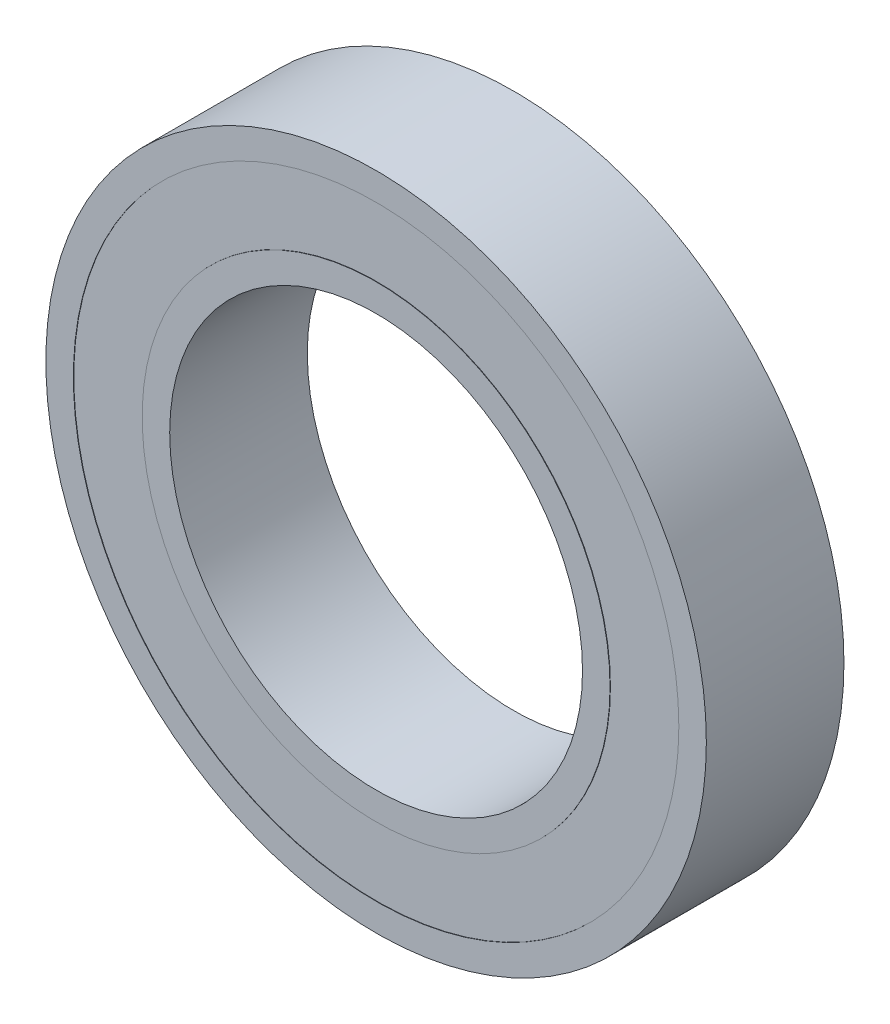
ISO-10303-21;
HEADER;
FILE_DESCRIPTION(('STEP AP214'),'2;1');
FILE_NAME('part.step','',(''),(''),'','','');
FILE_SCHEMA(('AUTOMOTIVE_DESIGN { 1 0 10303 214 1 1 1 1 }'));
ENDSEC;
DATA;
#1=APPLICATION_CONTEXT('core data for automotive mechanical design processes');
#2=APPLICATION_PROTOCOL_DEFINITION('international standard','automotive_design',2000,#1);
#3=PRODUCT_CONTEXT('',#1,'mechanical');
#4=PRODUCT('Part','Part','',(#3));
#5=PRODUCT_RELATED_PRODUCT_CATEGORY('part','',(#4));
#6=PRODUCT_DEFINITION_FORMATION('','',#4);
#7=PRODUCT_DEFINITION_CONTEXT('part definition',#1,'design');
#8=PRODUCT_DEFINITION('design','',#6,#7);
#9=PRODUCT_DEFINITION_SHAPE('','',#8);
#10=(LENGTH_UNIT() NAMED_UNIT(*) SI_UNIT(.MILLI.,.METRE.));
#11=(NAMED_UNIT(*) PLANE_ANGLE_UNIT() SI_UNIT($,.RADIAN.));
#12=(NAMED_UNIT(*) SI_UNIT($,.STERADIAN.) SOLID_ANGLE_UNIT());
#13=UNCERTAINTY_MEASURE_WITH_UNIT(LENGTH_MEASURE(1.E-05),#10,'distance_accuracy_value','');
#14=(GEOMETRIC_REPRESENTATION_CONTEXT(3) GLOBAL_UNCERTAINTY_ASSIGNED_CONTEXT((#13)) GLOBAL_UNIT_ASSIGNED_CONTEXT((#10,
#11,#12)) REPRESENTATION_CONTEXT('',''));
#15=CARTESIAN_POINT('',(0.,0.,0.));
#16=DIRECTION('',(0.,0.,1.));
#17=DIRECTION('',(1.,0.,0.));
#18=AXIS2_PLACEMENT_3D('',#15,#16,#17);
#19=CARTESIAN_POINT('',(0.,0.,-2.5));
#20=DIRECTION('',(0.,0.,1.));
#21=DIRECTION('',(1.,0.,0.));
#22=AXIS2_PLACEMENT_3D('',#19,#20,#21);
#23=CYLINDRICAL_SURFACE('',#22,11.);
#24=CARTESIAN_POINT('',(0.,0.,-2.5));
#25=DIRECTION('',(0.,0.,1.));
#26=DIRECTION('',(1.,0.,0.));
#27=AXIS2_PLACEMENT_3D('',#24,#25,#26);
#28=CIRCLE('',#27,11.);
#29=CARTESIAN_POINT('',(11.,0.,-2.5));
#30=VERTEX_POINT('',#29);
#31=EDGE_CURVE('E60',#30,#30,#28,.T.);
#32=ORIENTED_EDGE('',*,*,#31,.F.);
#33=EDGE_LOOP('',(#32));
#34=FACE_BOUND('',#33,.T.);
#35=CARTESIAN_POINT('',(0.,0.,-2.484375));
#36=DIRECTION('',(0.,0.,1.));
#37=DIRECTION('',(1.,0.,0.));
#38=AXIS2_PLACEMENT_3D('',#35,#36,#37);
#39=CIRCLE('',#38,11.);
#40=CARTESIAN_POINT('',(11.,0.,-2.484375));
#41=VERTEX_POINT('',#40);
#42=EDGE_CURVE('E11',#41,#41,#39,.F.);
#43=ORIENTED_EDGE('',*,*,#42,.F.);
#44=EDGE_LOOP('',(#43));
#45=FACE_BOUND('',#44,.T.);
#46=ADVANCED_FACE('F49',(#34,#45),#23,.F.);
#47=CARTESIAN_POINT('',(0.,0.,2.484375));
#48=DIRECTION('',(0.,0.,1.));
#49=DIRECTION('',(1.,0.,0.));
#50=AXIS2_PLACEMENT_3D('',#47,#48,#49);
#51=CIRCLE('',#50,11.);
#52=CARTESIAN_POINT('',(11.,0.,2.484375));
#53=VERTEX_POINT('',#52);
#54=EDGE_CURVE('E72',#53,#53,#51,.T.);
#55=ORIENTED_EDGE('',*,*,#54,.F.);
#56=EDGE_LOOP('',(#55));
#57=FACE_BOUND('',#56,.T.);
#58=CARTESIAN_POINT('',(0.,0.,2.5));
#59=DIRECTION('',(0.,0.,1.));
#60=DIRECTION('',(1.,0.,0.));
#61=AXIS2_PLACEMENT_3D('',#58,#59,#60);
#62=CIRCLE('',#61,11.);
#63=CARTESIAN_POINT('',(11.,0.,2.5));
#64=VERTEX_POINT('',#63);
#65=EDGE_CURVE('E69',#64,#64,#62,.T.);
#66=ORIENTED_EDGE('',*,*,#65,.T.);
#67=EDGE_LOOP('',(#66));
#68=FACE_BOUND('',#67,.T.);
#69=ADVANCED_FACE('F51',(#57,#68),#23,.F.);
#70=CARTESIAN_POINT('',(0.,0.,-2.5));
#71=DIRECTION('',(0.,0.,1.));
#72=DIRECTION('',(1.,0.,0.));
#73=AXIS2_PLACEMENT_3D('',#70,#71,#72);
#74=CYLINDRICAL_SURFACE('',#73,12.);
#75=CARTESIAN_POINT('',(0.,0.,-2.5));
#76=DIRECTION('',(0.,0.,1.));
#77=DIRECTION('',(1.,0.,0.));
#78=AXIS2_PLACEMENT_3D('',#75,#76,#77);
#79=CIRCLE('',#78,12.);
#80=CARTESIAN_POINT('',(12.,0.,-2.5));
#81=VERTEX_POINT('',#80);
#82=EDGE_CURVE('E56',#81,#81,#79,.T.);
#83=ORIENTED_EDGE('',*,*,#82,.T.);
#84=EDGE_LOOP('',(#83));
#85=FACE_BOUND('',#84,.T.);
#86=CARTESIAN_POINT('',(0.,0.,2.5));
#87=DIRECTION('',(0.,0.,1.));
#88=DIRECTION('',(1.,0.,0.));
#89=AXIS2_PLACEMENT_3D('',#86,#87,#88);
#90=CIRCLE('',#89,12.);
#91=CARTESIAN_POINT('',(12.,0.,2.5));
#92=VERTEX_POINT('',#91);
#93=EDGE_CURVE('E64',#92,#92,#90,.T.);
#94=ORIENTED_EDGE('',*,*,#93,.F.);
#95=EDGE_LOOP('',(#94));
#96=FACE_BOUND('',#95,.T.);
#97=ADVANCED_FACE('F124',(#85,#96),#74,.T.);
#98=CARTESIAN_POINT('',(0.,0.,-2.5));
#99=DIRECTION('',(0.,0.,1.));
#100=DIRECTION('',(1.,0.,0.));
#101=AXIS2_PLACEMENT_3D('',#98,#99,#100);
#102=PLANE('',#101);
#103=ORIENTED_EDGE('',*,*,#31,.T.);
#104=EDGE_LOOP('',(#103));
#105=FACE_BOUND('',#104,.T.);
#106=ORIENTED_EDGE('',*,*,#82,.F.);
#107=EDGE_LOOP('',(#106));
#108=FACE_BOUND('',#107,.T.);
#109=ADVANCED_FACE('F129',(#105,#108),#102,.F.);
#110=CARTESIAN_POINT('',(0.,0.,2.5));
#111=DIRECTION('',(0.,0.,1.));
#112=DIRECTION('',(1.,0.,0.));
#113=AXIS2_PLACEMENT_3D('',#110,#111,#112);
#114=PLANE('',#113);
#115=ORIENTED_EDGE('',*,*,#65,.F.);
#116=EDGE_LOOP('',(#115));
#117=FACE_BOUND('',#116,.T.);
#118=ORIENTED_EDGE('',*,*,#93,.T.);
#119=EDGE_LOOP('',(#118));
#120=FACE_BOUND('',#119,.T.);
#121=ADVANCED_FACE('F132',(#117,#120),#114,.T.);
#122=CARTESIAN_POINT('',(0.,0.,-2.484375));
#123=DIRECTION('',(0.,0.,1.));
#124=DIRECTION('',(1.,0.,0.));
#125=AXIS2_PLACEMENT_3D('',#122,#123,#124);
#126=PLANE('',#125);
#127=CARTESIAN_POINT('',(0.,0.,-2.484375));
#128=DIRECTION('',(0.,0.,1.));
#129=DIRECTION('',(1.,0.,0.));
#130=AXIS2_PLACEMENT_3D('',#127,#128,#129);
#131=CIRCLE('',#130,8.5);
#132=CARTESIAN_POINT('',(8.5,0.,-2.484375));
#133=VERTEX_POINT('',#132);
#134=EDGE_CURVE('E78',#133,#133,#131,.T.);
#135=ORIENTED_EDGE('',*,*,#134,.T.);
#136=EDGE_LOOP('',(#135));
#137=FACE_BOUND('',#136,.T.);
#138=ORIENTED_EDGE('',*,*,#42,.T.);
#139=EDGE_LOOP('',(#138));
#140=FACE_BOUND('',#139,.T.);
#141=ADVANCED_FACE('F138',(#137,#140),#126,.F.);
#142=CARTESIAN_POINT('',(0.,0.,2.484375));
#143=DIRECTION('',(0.,0.,1.));
#144=DIRECTION('',(1.,0.,0.));
#145=AXIS2_PLACEMENT_3D('',#142,#143,#144);
#146=PLANE('',#145);
#147=CARTESIAN_POINT('',(0.,0.,2.484375));
#148=DIRECTION('',(0.,0.,1.));
#149=DIRECTION('',(1.,0.,0.));
#150=AXIS2_PLACEMENT_3D('',#147,#148,#149);
#151=CIRCLE('',#150,8.5);
#152=CARTESIAN_POINT('',(8.5,0.,2.484375));
#153=VERTEX_POINT('',#152);
#154=EDGE_CURVE('E75',#153,#153,#151,.T.);
#155=ORIENTED_EDGE('',*,*,#154,.F.);
#156=EDGE_LOOP('',(#155));
#157=FACE_BOUND('',#156,.T.);
#158=ORIENTED_EDGE('',*,*,#54,.T.);
#159=EDGE_LOOP('',(#158));
#160=FACE_BOUND('',#159,.T.);
#161=ADVANCED_FACE('F117',(#157,#160),#146,.T.);
#162=CARTESIAN_POINT('',(0.,0.,-2.5));
#163=DIRECTION('',(0.,0.,1.));
#164=DIRECTION('',(1.,0.,0.));
#165=AXIS2_PLACEMENT_3D('',#162,#163,#164);
#166=CYLINDRICAL_SURFACE('',#165,8.5);
#167=CARTESIAN_POINT('',(0.,0.,-2.5));
#168=DIRECTION('',(0.,0.,1.));
#169=DIRECTION('',(1.,0.,0.));
#170=AXIS2_PLACEMENT_3D('',#167,#168,#169);
#171=CIRCLE('',#170,8.5);
#172=CARTESIAN_POINT('',(8.5,0.,-2.5));
#173=VERTEX_POINT('',#172);
#174=EDGE_CURVE('E81',#173,#173,#171,.T.);
#175=ORIENTED_EDGE('',*,*,#174,.T.);
#176=EDGE_LOOP('',(#175));
#177=FACE_BOUND('',#176,.T.);
#178=ORIENTED_EDGE('',*,*,#134,.F.);
#179=EDGE_LOOP('',(#178));
#180=FACE_BOUND('',#179,.T.);
#181=ADVANCED_FACE('F107',(#177,#180),#166,.T.);
#182=CARTESIAN_POINT('',(0.,0.,-2.5));
#183=DIRECTION('',(0.,0.,1.));
#184=DIRECTION('',(1.,0.,0.));
#185=AXIS2_PLACEMENT_3D('',#182,#183,#184);
#186=CYLINDRICAL_SURFACE('',#185,7.5);
#187=CARTESIAN_POINT('',(0.,0.,-2.5));
#188=DIRECTION('',(0.,0.,1.));
#189=DIRECTION('',(1.,0.,0.));
#190=AXIS2_PLACEMENT_3D('',#187,#188,#189);
#191=CIRCLE('',#190,7.5);
#192=CARTESIAN_POINT('',(7.5,0.,-2.5));
#193=VERTEX_POINT('',#192);
#194=EDGE_CURVE('E84',#193,#193,#191,.T.);
#195=ORIENTED_EDGE('',*,*,#194,.F.);
#196=EDGE_LOOP('',(#195));
#197=FACE_BOUND('',#196,.T.);
#198=CARTESIAN_POINT('',(0.,0.,2.5));
#199=DIRECTION('',(0.,0.,1.));
#200=DIRECTION('',(1.,0.,0.));
#201=AXIS2_PLACEMENT_3D('',#198,#199,#200);
#202=CIRCLE('',#201,7.5);
#203=CARTESIAN_POINT('',(7.5,0.,2.5));
#204=VERTEX_POINT('',#203);
#205=EDGE_CURVE('E90',#204,#204,#202,.T.);
#206=ORIENTED_EDGE('',*,*,#205,.T.);
#207=EDGE_LOOP('',(#206));
#208=FACE_BOUND('',#207,.T.);
#209=ADVANCED_FACE('F94',(#197,#208),#186,.F.);
#210=ORIENTED_EDGE('',*,*,#154,.T.);
#211=EDGE_LOOP('',(#210));
#212=FACE_BOUND('',#211,.T.);
#213=CARTESIAN_POINT('',(0.,0.,2.5));
#214=DIRECTION('',(0.,0.,1.));
#215=DIRECTION('',(1.,0.,0.));
#216=AXIS2_PLACEMENT_3D('',#213,#214,#215);
#217=CIRCLE('',#216,8.5);
#218=CARTESIAN_POINT('',(8.5,0.,2.5));
#219=VERTEX_POINT('',#218);
#220=EDGE_CURVE('E87',#219,#219,#217,.T.);
#221=ORIENTED_EDGE('',*,*,#220,.F.);
#222=EDGE_LOOP('',(#221));
#223=FACE_BOUND('',#222,.T.);
#224=ADVANCED_FACE('F103',(#212,#223),#166,.T.);
#225=CARTESIAN_POINT('',(0.,0.,-2.5));
#226=DIRECTION('',(0.,0.,1.));
#227=DIRECTION('',(1.,0.,0.));
#228=AXIS2_PLACEMENT_3D('',#225,#226,#227);
#229=PLANE('',#228);
#230=ORIENTED_EDGE('',*,*,#194,.T.);
#231=EDGE_LOOP('',(#230));
#232=FACE_BOUND('',#231,.T.);
#233=ORIENTED_EDGE('',*,*,#174,.F.);
#234=EDGE_LOOP('',(#233));
#235=FACE_BOUND('',#234,.T.);
#236=ADVANCED_FACE('F99',(#232,#235),#229,.F.);
#237=CARTESIAN_POINT('',(0.,0.,2.5));
#238=DIRECTION('',(0.,0.,1.));
#239=DIRECTION('',(1.,0.,0.));
#240=AXIS2_PLACEMENT_3D('',#237,#238,#239);
#241=PLANE('',#240);
#242=ORIENTED_EDGE('',*,*,#205,.F.);
#243=EDGE_LOOP('',(#242));
#244=FACE_BOUND('',#243,.T.);
#245=ORIENTED_EDGE('',*,*,#220,.T.);
#246=EDGE_LOOP('',(#245));
#247=FACE_BOUND('',#246,.T.);
#248=ADVANCED_FACE('F96',(#244,#247),#241,.T.);
#249=CLOSED_SHELL('',(#46,#69,#97,#109,#121,#141,#161,#181,#209,#224,#236,#248));
#250=MANIFOLD_SOLID_BREP('B2',#249);
#251=ADVANCED_BREP_SHAPE_REPRESENTATION('',(#18,#250),#14);
#252=SHAPE_DEFINITION_REPRESENTATION(#9,#251);
ENDSEC;
END-ISO-10303-21;
